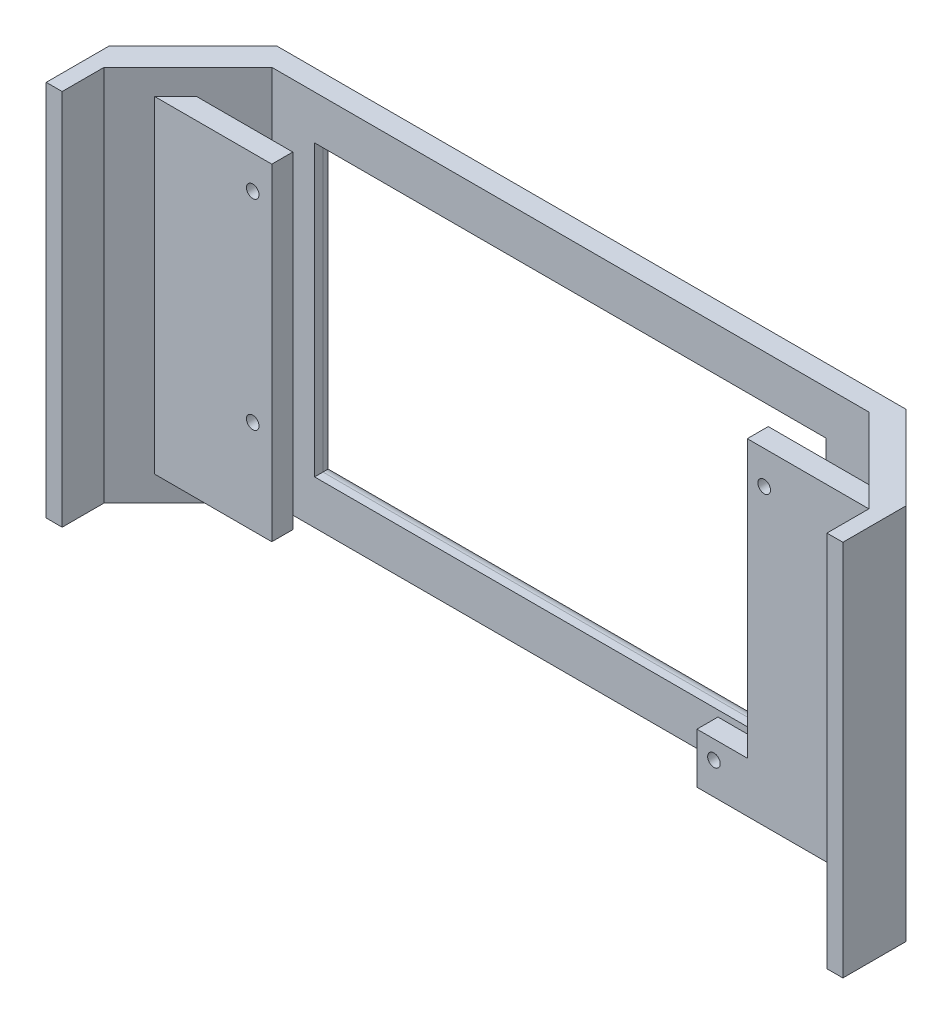
ISO-10303-21;
HEADER;
FILE_DESCRIPTION(('STEP AP214'),'2;1');
FILE_NAME('part.step','',(''),(''),'','','');
FILE_SCHEMA(('AUTOMOTIVE_DESIGN { 1 0 10303 214 1 1 1 1 }'));
ENDSEC;
DATA;
#1=APPLICATION_CONTEXT('core data for automotive mechanical design processes');
#2=APPLICATION_PROTOCOL_DEFINITION('international standard','automotive_design',2000,#1);
#3=PRODUCT_CONTEXT('',#1,'mechanical');
#4=PRODUCT('Part','Part','',(#3));
#5=PRODUCT_RELATED_PRODUCT_CATEGORY('part','',(#4));
#6=PRODUCT_DEFINITION_FORMATION('','',#4);
#7=PRODUCT_DEFINITION_CONTEXT('part definition',#1,'design');
#8=PRODUCT_DEFINITION('design','',#6,#7);
#9=PRODUCT_DEFINITION_SHAPE('','',#8);
#10=(LENGTH_UNIT() NAMED_UNIT(*) SI_UNIT(.MILLI.,.METRE.));
#11=(NAMED_UNIT(*) PLANE_ANGLE_UNIT() SI_UNIT($,.RADIAN.));
#12=(NAMED_UNIT(*) SI_UNIT($,.STERADIAN.) SOLID_ANGLE_UNIT());
#13=UNCERTAINTY_MEASURE_WITH_UNIT(LENGTH_MEASURE(1.E-05),#10,'distance_accuracy_value','');
#14=(GEOMETRIC_REPRESENTATION_CONTEXT(3) GLOBAL_UNCERTAINTY_ASSIGNED_CONTEXT((#13)) GLOBAL_UNIT_ASSIGNED_CONTEXT((#10,
#11,#12)) REPRESENTATION_CONTEXT('',''));
#15=CARTESIAN_POINT('',(0.,0.,0.));
#16=DIRECTION('',(0.,0.,1.));
#17=DIRECTION('',(1.,0.,0.));
#18=AXIS2_PLACEMENT_3D('',#15,#16,#17);
#19=CARTESIAN_POINT('',(0.,0.,5.));
#20=DIRECTION('',(0.,0.,1.));
#21=DIRECTION('',(1.,0.,0.));
#22=AXIS2_PLACEMENT_3D('',#19,#20,#21);
#23=PLANE('',#22);
#24=DIRECTION('',(1.,0.,0.));
#25=VECTOR('',#24,1.);
#26=CARTESIAN_POINT('',(-95.,-45.,5.));
#27=LINE('',#26,#25);
#28=CARTESIAN_POINT('',(-71.2000000000001,-45.,5.));
#29=VERTEX_POINT('',#28);
#30=CARTESIAN_POINT('',(71.2000000000001,-45.,5.));
#31=VERTEX_POINT('',#30);
#32=EDGE_CURVE('E388',#29,#31,#27,.T.);
#33=ORIENTED_EDGE('',*,*,#32,.T.);
#34=DIRECTION('',(0.,1.,0.));
#35=VECTOR('',#34,1.);
#36=CARTESIAN_POINT('',(71.2000000000001,0.,5.));
#37=LINE('',#36,#35);
#38=CARTESIAN_POINT('',(71.2,45.,5.));
#39=VERTEX_POINT('',#38);
#40=EDGE_CURVE('E437',#31,#39,#37,.T.);
#41=ORIENTED_EDGE('',*,*,#40,.T.);
#42=DIRECTION('',(-1.,0.,0.));
#43=VECTOR('',#42,1.);
#44=CARTESIAN_POINT('',(-95.,45.,5.));
#45=LINE('',#44,#43);
#46=CARTESIAN_POINT('',(-71.2000000000001,45.,5.));
#47=VERTEX_POINT('',#46);
#48=EDGE_CURVE('E385',#39,#47,#45,.T.);
#49=ORIENTED_EDGE('',*,*,#48,.T.);
#50=DIRECTION('',(0.,-1.,0.));
#51=VECTOR('',#50,1.);
#52=CARTESIAN_POINT('',(-71.2000000000001,0.,5.));
#53=LINE('',#52,#51);
#54=EDGE_CURVE('E435',#47,#29,#53,.T.);
#55=ORIENTED_EDGE('',*,*,#54,.T.);
#56=EDGE_LOOP('',(#33,#41,#49,#55));
#57=FACE_BOUND('',#56,.T.);
#58=DIRECTION('',(-1.,0.,0.));
#59=VECTOR('',#58,1.);
#60=CARTESIAN_POINT('',(-61.,34.5,5.));
#61=LINE('',#60,#59);
#62=CARTESIAN_POINT('',(61.,34.5,5.));
#63=VERTEX_POINT('',#62);
#64=CARTESIAN_POINT('',(-61.,34.5,5.));
#65=VERTEX_POINT('',#64);
#66=EDGE_CURVE('E366',#63,#65,#61,.T.);
#67=ORIENTED_EDGE('',*,*,#66,.F.);
#68=DIRECTION('',(0.,1.,0.));
#69=VECTOR('',#68,1.);
#70=CARTESIAN_POINT('',(61.,34.5,5.));
#71=LINE('',#70,#69);
#72=CARTESIAN_POINT('',(61.,-34.5,5.));
#73=VERTEX_POINT('',#72);
#74=EDGE_CURVE('E349',#73,#63,#71,.T.);
#75=ORIENTED_EDGE('',*,*,#74,.F.);
#76=DIRECTION('',(1.,0.,0.));
#77=VECTOR('',#76,1.);
#78=CARTESIAN_POINT('',(-61.,-34.5,5.));
#79=LINE('',#78,#77);
#80=CARTESIAN_POINT('',(-61.,-34.5,5.));
#81=VERTEX_POINT('',#80);
#82=EDGE_CURVE('E371',#81,#73,#79,.T.);
#83=ORIENTED_EDGE('',*,*,#82,.F.);
#84=DIRECTION('',(0.,-1.,0.));
#85=VECTOR('',#84,1.);
#86=CARTESIAN_POINT('',(-61.,34.5,5.));
#87=LINE('',#86,#85);
#88=EDGE_CURVE('E368',#65,#81,#87,.T.);
#89=ORIENTED_EDGE('',*,*,#88,.F.);
#90=EDGE_LOOP('',(#67,#75,#83,#89));
#91=FACE_BOUND('',#90,.T.);
#92=ADVANCED_FACE('F41',(#57,#91),#23,.T.);
#93=CARTESIAN_POINT('',(0.,0.,0.));
#94=DIRECTION('',(0.,0.,1.));
#95=DIRECTION('',(1.,0.,0.));
#96=AXIS2_PLACEMENT_3D('',#93,#94,#95);
#97=PLANE('',#96);
#98=DIRECTION('',(-1.,0.,0.));
#99=VECTOR('',#98,1.);
#100=CARTESIAN_POINT('',(-61.,37.5,0.));
#101=LINE('',#100,#99);
#102=CARTESIAN_POINT('',(64.,37.5,0.));
#103=VERTEX_POINT('',#102);
#104=CARTESIAN_POINT('',(-64.,37.5,0.));
#105=VERTEX_POINT('',#104);
#106=EDGE_CURVE('E403',#103,#105,#101,.T.);
#107=ORIENTED_EDGE('',*,*,#106,.T.);
#108=DIRECTION('',(0.,-1.,0.));
#109=VECTOR('',#108,1.);
#110=CARTESIAN_POINT('',(-64.,-34.5,0.));
#111=LINE('',#110,#109);
#112=CARTESIAN_POINT('',(-64.,-37.5,0.));
#113=VERTEX_POINT('',#112);
#114=EDGE_CURVE('E409',#105,#113,#111,.T.);
#115=ORIENTED_EDGE('',*,*,#114,.T.);
#116=DIRECTION('',(1.,0.,0.));
#117=VECTOR('',#116,1.);
#118=CARTESIAN_POINT('',(61.,-37.5,0.));
#119=LINE('',#118,#117);
#120=CARTESIAN_POINT('',(64.,-37.5,0.));
#121=VERTEX_POINT('',#120);
#122=EDGE_CURVE('E407',#113,#121,#119,.T.);
#123=ORIENTED_EDGE('',*,*,#122,.T.);
#124=DIRECTION('',(0.,1.,0.));
#125=VECTOR('',#124,1.);
#126=CARTESIAN_POINT('',(64.,34.5,0.));
#127=LINE('',#126,#125);
#128=EDGE_CURVE('E405',#121,#103,#127,.T.);
#129=ORIENTED_EDGE('',*,*,#128,.T.);
#130=EDGE_LOOP('',(#107,#115,#123,#129));
#131=FACE_BOUND('',#130,.T.);
#132=DIRECTION('',(-1.,0.,0.));
#133=VECTOR('',#132,1.);
#134=CARTESIAN_POINT('',(-95.,45.,0.));
#135=LINE('',#134,#133);
#136=CARTESIAN_POINT('',(74.9999999999998,45.,0.));
#137=VERTEX_POINT('',#136);
#138=CARTESIAN_POINT('',(-74.9999999999999,45.,0.));
#139=VERTEX_POINT('',#138);
#140=EDGE_CURVE('E240',#137,#139,#135,.T.);
#141=ORIENTED_EDGE('',*,*,#140,.F.);
#142=DIRECTION('',(0.,-1.,0.));
#143=VECTOR('',#142,1.);
#144=CARTESIAN_POINT('',(74.9999999999999,0.,0.));
#145=LINE('',#144,#143);
#146=CARTESIAN_POINT('',(74.9999999999999,-45.,0.));
#147=VERTEX_POINT('',#146);
#148=EDGE_CURVE('E260',#137,#147,#145,.T.);
#149=ORIENTED_EDGE('',*,*,#148,.T.);
#150=DIRECTION('',(1.,0.,0.));
#151=VECTOR('',#150,1.);
#152=CARTESIAN_POINT('',(-95.,-45.,0.));
#153=LINE('',#152,#151);
#154=CARTESIAN_POINT('',(-74.9999999999999,-45.,0.));
#155=VERTEX_POINT('',#154);
#156=EDGE_CURVE('E389',#155,#147,#153,.T.);
#157=ORIENTED_EDGE('',*,*,#156,.F.);
#158=DIRECTION('',(0.,1.,0.));
#159=VECTOR('',#158,1.);
#160=CARTESIAN_POINT('',(-74.9999999999999,0.,0.));
#161=LINE('',#160,#159);
#162=EDGE_CURVE('E264',#155,#139,#161,.T.);
#163=ORIENTED_EDGE('',*,*,#162,.T.);
#164=EDGE_LOOP('',(#141,#149,#157,#163));
#165=FACE_BOUND('',#164,.T.);
#166=ADVANCED_FACE('F443',(#131,#165),#97,.F.);
#167=CARTESIAN_POINT('',(95.,45.,5.));
#168=DIRECTION('',(-1.,0.,0.));
#169=DIRECTION('',(0.,-1.,0.));
#170=AXIS2_PLACEMENT_3D('',#167,#168,#169);
#171=PLANE('',#170);
#172=DIRECTION('',(0.,0.,-1.));
#173=VECTOR('',#172,1.);
#174=CARTESIAN_POINT('',(95.,-45.,5.));
#175=LINE('',#174,#173);
#176=CARTESIAN_POINT('',(95.,-45.,35.));
#177=VERTEX_POINT('',#176);
#178=CARTESIAN_POINT('',(95.,-45.,20.));
#179=VERTEX_POINT('',#178);
#180=EDGE_CURVE('E392',#177,#179,#175,.T.);
#181=ORIENTED_EDGE('',*,*,#180,.T.);
#182=DIRECTION('',(0.,1.,0.));
#183=VECTOR('',#182,1.);
#184=CARTESIAN_POINT('',(95.,45.,20.));
#185=LINE('',#184,#183);
#186=CARTESIAN_POINT('',(95.,45.,20.));
#187=VERTEX_POINT('',#186);
#188=EDGE_CURVE('E439',#179,#187,#185,.T.);
#189=ORIENTED_EDGE('',*,*,#188,.T.);
#190=DIRECTION('',(0.,0.,-1.));
#191=VECTOR('',#190,1.);
#192=CARTESIAN_POINT('',(95.,45.,5.));
#193=LINE('',#192,#191);
#194=CARTESIAN_POINT('',(95.,45.,35.));
#195=VERTEX_POINT('',#194);
#196=EDGE_CURVE('E255',#195,#187,#193,.T.);
#197=ORIENTED_EDGE('',*,*,#196,.F.);
#198=DIRECTION('',(0.,1.,0.));
#199=VECTOR('',#198,1.);
#200=CARTESIAN_POINT('',(95.,45.,35.));
#201=LINE('',#200,#199);
#202=EDGE_CURVE('E337',#177,#195,#201,.T.);
#203=ORIENTED_EDGE('',*,*,#202,.F.);
#204=EDGE_LOOP('',(#181,#189,#197,#203));
#205=FACE_BOUND('',#204,.T.);
#206=ADVANCED_FACE('F452',(#205),#171,.F.);
#207=CARTESIAN_POINT('',(-95.,45.,5.));
#208=DIRECTION('',(0.,-1.,0.));
#209=DIRECTION('',(0.,0.,-1.));
#210=AXIS2_PLACEMENT_3D('',#207,#208,#209);
#211=PLANE('',#210);
#212=ORIENTED_EDGE('',*,*,#196,.T.);
#213=DIRECTION('',(0.707106781186549,0.,0.707106781186546));
#214=VECTOR('',#213,1.);
#215=CARTESIAN_POINT('',(95.,45.,20.));
#216=LINE('',#215,#214);
#217=EDGE_CURVE('E244',#187,#137,#216,.F.);
#218=ORIENTED_EDGE('',*,*,#217,.T.);
#219=ORIENTED_EDGE('',*,*,#140,.T.);
#220=DIRECTION('',(0.707106781186549,0.,-0.707106781186547));
#221=VECTOR('',#220,1.);
#222=CARTESIAN_POINT('',(-95.,45.,20.));
#223=LINE('',#222,#221);
#224=CARTESIAN_POINT('',(-95.,45.,20.));
#225=VERTEX_POINT('',#224);
#226=EDGE_CURVE('E232',#139,#225,#223,.F.);
#227=ORIENTED_EDGE('',*,*,#226,.T.);
#228=DIRECTION('',(0.,0.,-1.));
#229=VECTOR('',#228,1.);
#230=CARTESIAN_POINT('',(-95.,45.,5.));
#231=LINE('',#230,#229);
#232=CARTESIAN_POINT('',(-95.,45.,35.));
#233=VERTEX_POINT('',#232);
#234=EDGE_CURVE('E237',#233,#225,#231,.T.);
#235=ORIENTED_EDGE('',*,*,#234,.F.);
#236=DIRECTION('',(-1.,0.,0.));
#237=VECTOR('',#236,1.);
#238=CARTESIAN_POINT('',(-95.,45.,35.));
#239=LINE('',#238,#237);
#240=CARTESIAN_POINT('',(-91.2,45.,35.));
#241=VERTEX_POINT('',#240);
#242=EDGE_CURVE('E341',#241,#233,#239,.T.);
#243=ORIENTED_EDGE('',*,*,#242,.F.);
#244=DIRECTION('',(0.,0.,-1.));
#245=VECTOR('',#244,1.);
#246=CARTESIAN_POINT('',(-91.2,45.,35.));
#247=LINE('',#246,#245);
#248=CARTESIAN_POINT('',(-91.2,45.,25.0000000000001));
#249=VERTEX_POINT('',#248);
#250=EDGE_CURVE('E343',#241,#249,#247,.T.);
#251=ORIENTED_EDGE('',*,*,#250,.T.);
#252=DIRECTION('',(0.707106781186543,0.,-0.707106781186552));
#253=VECTOR('',#252,1.);
#254=CARTESIAN_POINT('',(-83.0999999999999,45.,16.8999999999999));
#255=LINE('',#254,#253);
#256=EDGE_CURVE('E61',#249,#47,#255,.T.);
#257=ORIENTED_EDGE('',*,*,#256,.T.);
#258=ORIENTED_EDGE('',*,*,#48,.F.);
#259=DIRECTION('',(0.707106781186543,0.,0.707106781186552));
#260=VECTOR('',#259,1.);
#261=CARTESIAN_POINT('',(-11.8999999999989,45.,-78.1));
#262=LINE('',#261,#260);
#263=CARTESIAN_POINT('',(91.2,45.,25.0000000000001));
#264=VERTEX_POINT('',#263);
#265=EDGE_CURVE('E269',#39,#264,#262,.T.);
#266=ORIENTED_EDGE('',*,*,#265,.T.);
#267=DIRECTION('',(0.,0.,-1.));
#268=VECTOR('',#267,1.);
#269=CARTESIAN_POINT('',(91.2,45.,35.));
#270=LINE('',#269,#268);
#271=CARTESIAN_POINT('',(91.2,45.,35.));
#272=VERTEX_POINT('',#271);
#273=EDGE_CURVE('E350',#272,#264,#270,.T.);
#274=ORIENTED_EDGE('',*,*,#273,.F.);
#275=DIRECTION('',(-1.,0.,0.));
#276=VECTOR('',#275,1.);
#277=CARTESIAN_POINT('',(95.,45.,35.));
#278=LINE('',#277,#276);
#279=EDGE_CURVE('E361',#195,#272,#278,.T.);
#280=ORIENTED_EDGE('',*,*,#279,.F.);
#281=EDGE_LOOP('',(#212,#218,#219,#227,#235,#243,#251,#257,#258,#266,#274,#280));
#282=FACE_BOUND('',#281,.T.);
#283=ADVANCED_FACE('F235',(#282),#211,.F.);
#284=CARTESIAN_POINT('',(-95.,45.,5.));
#285=DIRECTION('',(1.,0.,0.));
#286=DIRECTION('',(0.,0.,-1.));
#287=AXIS2_PLACEMENT_3D('',#284,#285,#286);
#288=PLANE('',#287);
#289=ORIENTED_EDGE('',*,*,#234,.T.);
#290=DIRECTION('',(0.,-1.,0.));
#291=VECTOR('',#290,1.);
#292=CARTESIAN_POINT('',(-95.,45.,20.));
#293=LINE('',#292,#291);
#294=CARTESIAN_POINT('',(-95.,-45.,20.));
#295=VERTEX_POINT('',#294);
#296=EDGE_CURVE('E251',#225,#295,#293,.T.);
#297=ORIENTED_EDGE('',*,*,#296,.T.);
#298=DIRECTION('',(0.,0.,-1.));
#299=VECTOR('',#298,1.);
#300=CARTESIAN_POINT('',(-95.,-45.,5.));
#301=LINE('',#300,#299);
#302=CARTESIAN_POINT('',(-95.,-45.,35.));
#303=VERTEX_POINT('',#302);
#304=EDGE_CURVE('E256',#303,#295,#301,.T.);
#305=ORIENTED_EDGE('',*,*,#304,.F.);
#306=DIRECTION('',(0.,-1.,0.));
#307=VECTOR('',#306,1.);
#308=CARTESIAN_POINT('',(-95.,45.,35.));
#309=LINE('',#308,#307);
#310=EDGE_CURVE('E254',#233,#303,#309,.T.);
#311=ORIENTED_EDGE('',*,*,#310,.F.);
#312=EDGE_LOOP('',(#289,#297,#305,#311));
#313=FACE_BOUND('',#312,.T.);
#314=ADVANCED_FACE('F250',(#313),#288,.F.);
#315=CARTESIAN_POINT('',(-95.,-45.,5.));
#316=DIRECTION('',(0.,1.,0.));
#317=DIRECTION('',(0.,0.,1.));
#318=AXIS2_PLACEMENT_3D('',#315,#316,#317);
#319=PLANE('',#318);
#320=ORIENTED_EDGE('',*,*,#156,.T.);
#321=DIRECTION('',(-0.707106781186549,0.,-0.707106781186546));
#322=VECTOR('',#321,1.);
#323=CARTESIAN_POINT('',(95.,-45.,20.));
#324=LINE('',#323,#322);
#325=EDGE_CURVE('E11',#147,#179,#324,.F.);
#326=ORIENTED_EDGE('',*,*,#325,.T.);
#327=ORIENTED_EDGE('',*,*,#180,.F.);
#328=DIRECTION('',(1.,0.,0.));
#329=VECTOR('',#328,1.);
#330=CARTESIAN_POINT('',(95.,-45.,35.));
#331=LINE('',#330,#329);
#332=CARTESIAN_POINT('',(91.2,-45.,35.));
#333=VERTEX_POINT('',#332);
#334=EDGE_CURVE('E356',#333,#177,#331,.T.);
#335=ORIENTED_EDGE('',*,*,#334,.F.);
#336=DIRECTION('',(0.,0.,-1.));
#337=VECTOR('',#336,1.);
#338=CARTESIAN_POINT('',(91.2,-45.,35.));
#339=LINE('',#338,#337);
#340=CARTESIAN_POINT('',(91.2,-45.,25.0000000000001));
#341=VERTEX_POINT('',#340);
#342=EDGE_CURVE('E353',#333,#341,#339,.T.);
#343=ORIENTED_EDGE('',*,*,#342,.T.);
#344=DIRECTION('',(-0.707106781186543,0.,-0.707106781186552));
#345=VECTOR('',#344,1.);
#346=CARTESIAN_POINT('',(-11.8999999999989,-45.,-78.1));
#347=LINE('',#346,#345);
#348=EDGE_CURVE('E262',#341,#31,#347,.T.);
#349=ORIENTED_EDGE('',*,*,#348,.T.);
#350=ORIENTED_EDGE('',*,*,#32,.F.);
#351=DIRECTION('',(-0.707106781186543,0.,0.707106781186552));
#352=VECTOR('',#351,1.);
#353=CARTESIAN_POINT('',(-83.0999999999999,-45.,16.8999999999999));
#354=LINE('',#353,#352);
#355=CARTESIAN_POINT('',(-91.2,-45.,25.0000000000001));
#356=VERTEX_POINT('',#355);
#357=EDGE_CURVE('E245',#29,#356,#354,.T.);
#358=ORIENTED_EDGE('',*,*,#357,.T.);
#359=DIRECTION('',(0.,0.,-1.));
#360=VECTOR('',#359,1.);
#361=CARTESIAN_POINT('',(-91.2,-45.,35.));
#362=LINE('',#361,#360);
#363=CARTESIAN_POINT('',(-91.2,-45.,35.));
#364=VERTEX_POINT('',#363);
#365=EDGE_CURVE('E346',#364,#356,#362,.T.);
#366=ORIENTED_EDGE('',*,*,#365,.F.);
#367=DIRECTION('',(1.,0.,0.));
#368=VECTOR('',#367,1.);
#369=CARTESIAN_POINT('',(-95.,-45.,35.));
#370=LINE('',#369,#368);
#371=EDGE_CURVE('E336',#303,#364,#370,.T.);
#372=ORIENTED_EDGE('',*,*,#371,.F.);
#373=ORIENTED_EDGE('',*,*,#304,.T.);
#374=DIRECTION('',(-0.707106781186549,0.,0.707106781186547));
#375=VECTOR('',#374,1.);
#376=CARTESIAN_POINT('',(-95.,-45.,20.));
#377=LINE('',#376,#375);
#378=EDGE_CURVE('E52',#295,#155,#377,.F.);
#379=ORIENTED_EDGE('',*,*,#378,.T.);
#380=EDGE_LOOP('',(#320,#326,#327,#335,#343,#349,#350,#358,#366,#372,#373,#379));
#381=FACE_BOUND('',#380,.T.);
#382=ADVANCED_FACE('F447',(#381),#319,.F.);
#383=CARTESIAN_POINT('',(61.,34.5,5.));
#384=DIRECTION('',(-1.,0.,0.));
#385=DIRECTION('',(0.,-1.,0.));
#386=AXIS2_PLACEMENT_3D('',#383,#384,#385);
#387=PLANE('',#386);
#388=DIRECTION('',(0.,0.,-1.));
#389=VECTOR('',#388,1.);
#390=CARTESIAN_POINT('',(61.,34.5,5.));
#391=LINE('',#390,#389);
#392=CARTESIAN_POINT('',(61.,34.5,3.));
#393=VERTEX_POINT('',#392);
#394=EDGE_CURVE('E382',#63,#393,#391,.T.);
#395=ORIENTED_EDGE('',*,*,#394,.T.);
#396=DIRECTION('',(0.,1.,0.));
#397=VECTOR('',#396,1.);
#398=CARTESIAN_POINT('',(61.,-34.5,3.));
#399=LINE('',#398,#397);
#400=CARTESIAN_POINT('',(61.,-34.5,3.));
#401=VERTEX_POINT('',#400);
#402=EDGE_CURVE('E417',#393,#401,#399,.F.);
#403=ORIENTED_EDGE('',*,*,#402,.T.);
#404=DIRECTION('',(0.,0.,-1.));
#405=VECTOR('',#404,1.);
#406=CARTESIAN_POINT('',(61.,-34.5,5.));
#407=LINE('',#406,#405);
#408=EDGE_CURVE('E373',#73,#401,#407,.T.);
#409=ORIENTED_EDGE('',*,*,#408,.F.);
#410=ORIENTED_EDGE('',*,*,#74,.T.);
#411=EDGE_LOOP('',(#395,#403,#409,#410));
#412=FACE_BOUND('',#411,.T.);
#413=ADVANCED_FACE('F505',(#412),#387,.T.);
#414=CARTESIAN_POINT('',(-61.,34.5,5.));
#415=DIRECTION('',(0.,-1.,0.));
#416=DIRECTION('',(0.,0.,-1.));
#417=AXIS2_PLACEMENT_3D('',#414,#415,#416);
#418=PLANE('',#417);
#419=DIRECTION('',(0.,0.,-1.));
#420=VECTOR('',#419,1.);
#421=CARTESIAN_POINT('',(-61.,34.5,5.));
#422=LINE('',#421,#420);
#423=CARTESIAN_POINT('',(-61.,34.5,3.));
#424=VERTEX_POINT('',#423);
#425=EDGE_CURVE('E379',#65,#424,#422,.T.);
#426=ORIENTED_EDGE('',*,*,#425,.T.);
#427=DIRECTION('',(-1.,0.,0.));
#428=VECTOR('',#427,1.);
#429=CARTESIAN_POINT('',(61.,34.5,3.));
#430=LINE('',#429,#428);
#431=EDGE_CURVE('E419',#424,#393,#430,.F.);
#432=ORIENTED_EDGE('',*,*,#431,.T.);
#433=ORIENTED_EDGE('',*,*,#394,.F.);
#434=ORIENTED_EDGE('',*,*,#66,.T.);
#435=EDGE_LOOP('',(#426,#432,#433,#434));
#436=FACE_BOUND('',#435,.T.);
#437=ADVANCED_FACE('F812',(#436),#418,.T.);
#438=CARTESIAN_POINT('',(-61.,34.5,5.));
#439=DIRECTION('',(1.,0.,0.));
#440=DIRECTION('',(0.,1.,0.));
#441=AXIS2_PLACEMENT_3D('',#438,#439,#440);
#442=PLANE('',#441);
#443=DIRECTION('',(0.,0.,-1.));
#444=VECTOR('',#443,1.);
#445=CARTESIAN_POINT('',(-61.,-34.5,5.));
#446=LINE('',#445,#444);
#447=CARTESIAN_POINT('',(-61.,-34.5,3.));
#448=VERTEX_POINT('',#447);
#449=EDGE_CURVE('E376',#81,#448,#446,.T.);
#450=ORIENTED_EDGE('',*,*,#449,.T.);
#451=DIRECTION('',(0.,-1.,0.));
#452=VECTOR('',#451,1.);
#453=CARTESIAN_POINT('',(-61.,34.5,3.));
#454=LINE('',#453,#452);
#455=EDGE_CURVE('E412',#448,#424,#454,.F.);
#456=ORIENTED_EDGE('',*,*,#455,.T.);
#457=ORIENTED_EDGE('',*,*,#425,.F.);
#458=ORIENTED_EDGE('',*,*,#88,.T.);
#459=EDGE_LOOP('',(#450,#456,#457,#458));
#460=FACE_BOUND('',#459,.T.);
#461=ADVANCED_FACE('F821',(#460),#442,.T.);
#462=CARTESIAN_POINT('',(-61.,-34.5,5.));
#463=DIRECTION('',(0.,1.,0.));
#464=DIRECTION('',(0.,0.,1.));
#465=AXIS2_PLACEMENT_3D('',#462,#463,#464);
#466=PLANE('',#465);
#467=ORIENTED_EDGE('',*,*,#408,.T.);
#468=DIRECTION('',(1.,0.,0.));
#469=VECTOR('',#468,1.);
#470=CARTESIAN_POINT('',(-61.,-34.5,3.));
#471=LINE('',#470,#469);
#472=EDGE_CURVE('E415',#401,#448,#471,.F.);
#473=ORIENTED_EDGE('',*,*,#472,.T.);
#474=ORIENTED_EDGE('',*,*,#449,.F.);
#475=ORIENTED_EDGE('',*,*,#82,.T.);
#476=EDGE_LOOP('',(#467,#473,#474,#475));
#477=FACE_BOUND('',#476,.T.);
#478=ADVANCED_FACE('F746',(#477),#466,.T.);
#479=CARTESIAN_POINT('',(91.2,45.,35.));
#480=DIRECTION('',(1.,0.,0.));
#481=DIRECTION('',(0.,1.,0.));
#482=AXIS2_PLACEMENT_3D('',#479,#480,#481);
#483=PLANE('',#482);
#484=ORIENTED_EDGE('',*,*,#273,.T.);
#485=DIRECTION('',(0.,-1.,0.));
#486=VECTOR('',#485,1.);
#487=CARTESIAN_POINT('',(91.2,45.,25.0000000000001));
#488=LINE('',#487,#486);
#489=EDGE_CURVE('E421',#264,#341,#488,.T.);
#490=ORIENTED_EDGE('',*,*,#489,.T.);
#491=ORIENTED_EDGE('',*,*,#342,.F.);
#492=DIRECTION('',(0.,-1.,0.));
#493=VECTOR('',#492,1.);
#494=CARTESIAN_POINT('',(91.2,45.,35.));
#495=LINE('',#494,#493);
#496=EDGE_CURVE('E359',#272,#333,#495,.T.);
#497=ORIENTED_EDGE('',*,*,#496,.F.);
#498=EDGE_LOOP('',(#484,#490,#491,#497));
#499=FACE_BOUND('',#498,.T.);
#500=ADVANCED_FACE('F463',(#499),#483,.F.);
#501=CARTESIAN_POINT('',(0.,0.,35.));
#502=DIRECTION('',(0.,0.,-1.));
#503=DIRECTION('',(-1.,0.,0.));
#504=AXIS2_PLACEMENT_3D('',#501,#502,#503);
#505=PLANE('',#504);
#506=ORIENTED_EDGE('',*,*,#202,.T.);
#507=ORIENTED_EDGE('',*,*,#279,.T.);
#508=ORIENTED_EDGE('',*,*,#496,.T.);
#509=ORIENTED_EDGE('',*,*,#334,.T.);
#510=EDGE_LOOP('',(#506,#507,#508,#509));
#511=FACE_BOUND('',#510,.T.);
#512=ADVANCED_FACE('F458',(#511),#505,.F.);
#513=CARTESIAN_POINT('',(-91.2,45.,35.));
#514=DIRECTION('',(-1.,0.,0.));
#515=DIRECTION('',(0.,-1.,0.));
#516=AXIS2_PLACEMENT_3D('',#513,#514,#515);
#517=PLANE('',#516);
#518=ORIENTED_EDGE('',*,*,#365,.T.);
#519=DIRECTION('',(0.,1.,0.));
#520=VECTOR('',#519,1.);
#521=CARTESIAN_POINT('',(-91.2,45.,25.0000000000001));
#522=LINE('',#521,#520);
#523=EDGE_CURVE('E259',#356,#249,#522,.T.);
#524=ORIENTED_EDGE('',*,*,#523,.T.);
#525=ORIENTED_EDGE('',*,*,#250,.F.);
#526=DIRECTION('',(0.,1.,0.));
#527=VECTOR('',#526,1.);
#528=CARTESIAN_POINT('',(-91.2,45.,35.));
#529=LINE('',#528,#527);
#530=EDGE_CURVE('E339',#364,#241,#529,.T.);
#531=ORIENTED_EDGE('',*,*,#530,.F.);
#532=EDGE_LOOP('',(#518,#524,#525,#531));
#533=FACE_BOUND('',#532,.T.);
#534=ADVANCED_FACE('F476',(#533),#517,.F.);
#535=CARTESIAN_POINT('',(0.,0.,35.));
#536=DIRECTION('',(0.,0.,1.));
#537=DIRECTION('',(1.,0.,0.));
#538=AXIS2_PLACEMENT_3D('',#535,#536,#537);
#539=PLANE('',#538);
#540=ORIENTED_EDGE('',*,*,#310,.T.);
#541=ORIENTED_EDGE('',*,*,#371,.T.);
#542=ORIENTED_EDGE('',*,*,#530,.T.);
#543=ORIENTED_EDGE('',*,*,#242,.T.);
#544=EDGE_LOOP('',(#540,#541,#542,#543));
#545=FACE_BOUND('',#544,.T.);
#546=ADVANCED_FACE('F481',(#545),#539,.T.);
#547=CARTESIAN_POINT('',(-91.2,-92.2652091923859,14.));
#548=DIRECTION('',(0.,0.,-1.));
#549=DIRECTION('',(-1.,0.,0.));
#550=AXIS2_PLACEMENT_3D('',#547,#548,#549);
#551=PLANE('',#550);
#552=CARTESIAN_POINT('',(-61.75,-16.61,14.));
#553=DIRECTION('',(0.,0.,-1.));
#554=DIRECTION('',(-1.,0.,0.));
#555=AXIS2_PLACEMENT_3D('',#552,#553,#554);
#556=CIRCLE('',#555,1.5);
#557=CARTESIAN_POINT('',(-63.25,-16.61,14.));
#558=VERTEX_POINT('',#557);
#559=EDGE_CURVE('E928',#558,#558,#556,.F.);
#560=ORIENTED_EDGE('',*,*,#559,.T.);
#561=EDGE_LOOP('',(#560));
#562=FACE_BOUND('',#561,.T.);
#563=CARTESIAN_POINT('',(-61.75,31.13,14.));
#564=DIRECTION('',(0.,0.,-1.));
#565=DIRECTION('',(-1.,0.,0.));
#566=AXIS2_PLACEMENT_3D('',#563,#564,#565);
#567=CIRCLE('',#566,1.5);
#568=CARTESIAN_POINT('',(-63.25,31.13,14.));
#569=VERTEX_POINT('',#568);
#570=EDGE_CURVE('E297',#569,#569,#567,.F.);
#571=ORIENTED_EDGE('',*,*,#570,.T.);
#572=EDGE_LOOP('',(#571));
#573=FACE_BOUND('',#572,.T.);
#574=DIRECTION('',(1.,0.,0.));
#575=VECTOR('',#574,1.);
#576=CARTESIAN_POINT('',(-91.2,39.,14.));
#577=LINE('',#576,#575);
#578=CARTESIAN_POINT('',(-80.2,39.,14.));
#579=VERTEX_POINT('',#578);
#580=CARTESIAN_POINT('',(-57.2,39.,14.));
#581=VERTEX_POINT('',#580);
#582=EDGE_CURVE('E294',#579,#581,#577,.T.);
#583=ORIENTED_EDGE('',*,*,#582,.T.);
#584=DIRECTION('',(0.,1.,0.));
#585=VECTOR('',#584,1.);
#586=CARTESIAN_POINT('',(-57.2,-92.2652091923859,14.));
#587=LINE('',#586,#585);
#588=CARTESIAN_POINT('',(-57.2,-39.,14.));
#589=VERTEX_POINT('',#588);
#590=EDGE_CURVE('E326',#589,#581,#587,.T.);
#591=ORIENTED_EDGE('',*,*,#590,.F.);
#592=DIRECTION('',(-1.,0.,0.));
#593=VECTOR('',#592,1.);
#594=CARTESIAN_POINT('',(-91.2,-39.,14.));
#595=LINE('',#594,#593);
#596=CARTESIAN_POINT('',(-80.1999999999999,-39.,14.));
#597=VERTEX_POINT('',#596);
#598=EDGE_CURVE('E287',#589,#597,#595,.T.);
#599=ORIENTED_EDGE('',*,*,#598,.T.);
#600=DIRECTION('',(0.,1.,0.));
#601=VECTOR('',#600,1.);
#602=CARTESIAN_POINT('',(-80.1999999999999,-92.2652091923859,14.));
#603=LINE('',#602,#601);
#604=EDGE_CURVE('E46',#597,#579,#603,.T.);
#605=ORIENTED_EDGE('',*,*,#604,.T.);
#606=EDGE_LOOP('',(#583,#591,#599,#605));
#607=FACE_BOUND('',#606,.T.);
#608=ADVANCED_FACE('F483',(#562,#573,#607),#551,.T.);
#609=CARTESIAN_POINT('',(-57.2,-92.2652091923859,14.));
#610=DIRECTION('',(1.,0.,0.));
#611=DIRECTION('',(0.,0.,-1.));
#612=AXIS2_PLACEMENT_3D('',#609,#610,#611);
#613=PLANE('',#612);
#614=DIRECTION('',(0.,0.,-1.));
#615=VECTOR('',#614,1.);
#616=CARTESIAN_POINT('',(-57.2,39.,14.));
#617=LINE('',#616,#615);
#618=CARTESIAN_POINT('',(-57.2,39.,19.));
#619=VERTEX_POINT('',#618);
#620=EDGE_CURVE('E292',#619,#581,#617,.T.);
#621=ORIENTED_EDGE('',*,*,#620,.F.);
#622=DIRECTION('',(0.,1.,0.));
#623=VECTOR('',#622,1.);
#624=CARTESIAN_POINT('',(-57.2,-92.2652091923859,19.));
#625=LINE('',#624,#623);
#626=CARTESIAN_POINT('',(-57.2,-39.,19.));
#627=VERTEX_POINT('',#626);
#628=EDGE_CURVE('E296',#627,#619,#625,.T.);
#629=ORIENTED_EDGE('',*,*,#628,.F.);
#630=DIRECTION('',(0.,0.,1.));
#631=VECTOR('',#630,1.);
#632=CARTESIAN_POINT('',(-57.2,-39.,14.));
#633=LINE('',#632,#631);
#634=EDGE_CURVE('E323',#589,#627,#633,.T.);
#635=ORIENTED_EDGE('',*,*,#634,.F.);
#636=ORIENTED_EDGE('',*,*,#590,.T.);
#637=EDGE_LOOP('',(#621,#629,#635,#636));
#638=FACE_BOUND('',#637,.T.);
#639=ADVANCED_FACE('F490',(#638),#613,.T.);
#640=CARTESIAN_POINT('',(-91.2,-92.2652091923859,19.));
#641=DIRECTION('',(0.,0.,1.));
#642=DIRECTION('',(1.,0.,0.));
#643=AXIS2_PLACEMENT_3D('',#640,#641,#642);
#644=PLANE('',#643);
#645=CARTESIAN_POINT('',(-61.75,-16.61,19.));
#646=DIRECTION('',(0.,0.,1.));
#647=DIRECTION('',(1.,0.,0.));
#648=AXIS2_PLACEMENT_3D('',#645,#646,#647);
#649=CIRCLE('',#648,1.5);
#650=CARTESIAN_POINT('',(-60.25,-16.61,19.));
#651=VERTEX_POINT('',#650);
#652=EDGE_CURVE('E307',#651,#651,#649,.T.);
#653=ORIENTED_EDGE('',*,*,#652,.F.);
#654=EDGE_LOOP('',(#653));
#655=FACE_BOUND('',#654,.T.);
#656=CARTESIAN_POINT('',(-61.75,31.13,19.));
#657=DIRECTION('',(0.,0.,1.));
#658=DIRECTION('',(1.,0.,0.));
#659=AXIS2_PLACEMENT_3D('',#656,#657,#658);
#660=CIRCLE('',#659,1.5);
#661=CARTESIAN_POINT('',(-60.25,31.13,19.));
#662=VERTEX_POINT('',#661);
#663=EDGE_CURVE('E302',#662,#662,#660,.T.);
#664=ORIENTED_EDGE('',*,*,#663,.F.);
#665=EDGE_LOOP('',(#664));
#666=FACE_BOUND('',#665,.T.);
#667=DIRECTION('',(1.,0.,0.));
#668=VECTOR('',#667,1.);
#669=CARTESIAN_POINT('',(-91.2,39.,19.));
#670=LINE('',#669,#668);
#671=CARTESIAN_POINT('',(-85.1999999999999,39.,19.));
#672=VERTEX_POINT('',#671);
#673=EDGE_CURVE('E313',#672,#619,#670,.T.);
#674=ORIENTED_EDGE('',*,*,#673,.F.);
#675=DIRECTION('',(0.,1.,0.));
#676=VECTOR('',#675,1.);
#677=CARTESIAN_POINT('',(-85.1999999999999,45.,19.));
#678=LINE('',#677,#676);
#679=CARTESIAN_POINT('',(-85.1999999999999,-39.,19.));
#680=VERTEX_POINT('',#679);
#681=EDGE_CURVE('E283',#680,#672,#678,.T.);
#682=ORIENTED_EDGE('',*,*,#681,.F.);
#683=DIRECTION('',(-1.,0.,0.));
#684=VECTOR('',#683,1.);
#685=CARTESIAN_POINT('',(-91.2,-39.,19.));
#686=LINE('',#685,#684);
#687=EDGE_CURVE('E318',#627,#680,#686,.T.);
#688=ORIENTED_EDGE('',*,*,#687,.F.);
#689=ORIENTED_EDGE('',*,*,#628,.T.);
#690=EDGE_LOOP('',(#674,#682,#688,#689));
#691=FACE_BOUND('',#690,.T.);
#692=ADVANCED_FACE('F714',(#655,#666,#691),#644,.T.);
#693=CARTESIAN_POINT('',(91.2,-92.2652091923859,19.));
#694=DIRECTION('',(0.,0.,1.));
#695=DIRECTION('',(1.,0.,0.));
#696=AXIS2_PLACEMENT_3D('',#693,#694,#695);
#697=PLANE('',#696);
#698=DIRECTION('',(1.,0.,0.));
#699=VECTOR('',#698,1.);
#700=CARTESIAN_POINT('',(44.2,-27.,19.));
#701=LINE('',#700,#699);
#702=CARTESIAN_POINT('',(44.2,-27.,19.));
#703=VERTEX_POINT('',#702);
#704=CARTESIAN_POINT('',(56.2,-27.,19.));
#705=VERTEX_POINT('',#704);
#706=EDGE_CURVE('E432',#703,#705,#701,.T.);
#707=ORIENTED_EDGE('',*,*,#706,.F.);
#708=DIRECTION('',(0.,1.,0.));
#709=VECTOR('',#708,1.);
#710=CARTESIAN_POINT('',(44.2,-92.2652091923859,19.));
#711=LINE('',#710,#709);
#712=CARTESIAN_POINT('',(44.2,-39.,19.));
#713=VERTEX_POINT('',#712);
#714=EDGE_CURVE('E291',#713,#703,#711,.T.);
#715=ORIENTED_EDGE('',*,*,#714,.F.);
#716=CARTESIAN_POINT('',(85.1999999999999,-39.,19.));
#717=VERTEX_POINT('',#716);
#718=EDGE_CURVE('E316',#717,#713,#686,.T.);
#719=ORIENTED_EDGE('',*,*,#718,.F.);
#720=DIRECTION('',(0.,1.,0.));
#721=VECTOR('',#720,1.);
#722=CARTESIAN_POINT('',(85.1999999999999,-92.2652091923859,19.));
#723=LINE('',#722,#721);
#724=CARTESIAN_POINT('',(85.1999999999999,39.,19.));
#725=VERTEX_POINT('',#724);
#726=EDGE_CURVE('E288',#717,#725,#723,.T.);
#727=ORIENTED_EDGE('',*,*,#726,.T.);
#728=CARTESIAN_POINT('',(56.2,39.,19.));
#729=VERTEX_POINT('',#728);
#730=EDGE_CURVE('E315',#729,#725,#670,.T.);
#731=ORIENTED_EDGE('',*,*,#730,.F.);
#732=DIRECTION('',(0.,1.,0.));
#733=VECTOR('',#732,1.);
#734=CARTESIAN_POINT('',(56.2,39.,19.));
#735=LINE('',#734,#733);
#736=EDGE_CURVE('E916',#705,#729,#735,.T.);
#737=ORIENTED_EDGE('',*,*,#736,.F.);
#738=EDGE_LOOP('',(#707,#715,#719,#727,#731,#737));
#739=FACE_BOUND('',#738,.T.);
#740=CARTESIAN_POINT('',(48.25,-31.3800000000001,19.));
#741=DIRECTION('',(0.,0.,1.));
#742=DIRECTION('',(1.,0.,0.));
#743=AXIS2_PLACEMENT_3D('',#740,#741,#742);
#744=CIRCLE('',#743,1.5);
#745=CARTESIAN_POINT('',(49.75,-31.3800000000001,19.));
#746=VERTEX_POINT('',#745);
#747=EDGE_CURVE('E937',#746,#746,#744,.T.);
#748=ORIENTED_EDGE('',*,*,#747,.F.);
#749=EDGE_LOOP('',(#748));
#750=FACE_BOUND('',#749,.T.);
#751=CARTESIAN_POINT('',(60.23,31.13,19.));
#752=DIRECTION('',(0.,0.,1.));
#753=DIRECTION('',(1.,0.,0.));
#754=AXIS2_PLACEMENT_3D('',#751,#752,#753);
#755=CIRCLE('',#754,1.5);
#756=CARTESIAN_POINT('',(61.73,31.13,19.));
#757=VERTEX_POINT('',#756);
#758=EDGE_CURVE('E931',#757,#757,#755,.T.);
#759=ORIENTED_EDGE('',*,*,#758,.F.);
#760=EDGE_LOOP('',(#759));
#761=FACE_BOUND('',#760,.T.);
#762=ADVANCED_FACE('F718',(#739,#750,#761),#697,.T.);
#763=CARTESIAN_POINT('',(44.2,-92.2652091923859,14.));
#764=DIRECTION('',(-1.,0.,0.));
#765=DIRECTION('',(0.,0.,1.));
#766=AXIS2_PLACEMENT_3D('',#763,#764,#765);
#767=PLANE('',#766);
#768=DIRECTION('',(0.,0.,1.));
#769=VECTOR('',#768,1.);
#770=CARTESIAN_POINT('',(44.2,-27.,-53.0820393249937));
#771=LINE('',#770,#769);
#772=CARTESIAN_POINT('',(44.2,-27.,14.));
#773=VERTEX_POINT('',#772);
#774=EDGE_CURVE('E103',#773,#703,#771,.T.);
#775=ORIENTED_EDGE('',*,*,#774,.F.);
#776=DIRECTION('',(0.,1.,0.));
#777=VECTOR('',#776,1.);
#778=CARTESIAN_POINT('',(44.2,-92.2652091923859,14.));
#779=LINE('',#778,#777);
#780=CARTESIAN_POINT('',(44.2,-39.,14.));
#781=VERTEX_POINT('',#780);
#782=EDGE_CURVE('E284',#781,#773,#779,.T.);
#783=ORIENTED_EDGE('',*,*,#782,.F.);
#784=DIRECTION('',(0.,0.,-1.));
#785=VECTOR('',#784,1.);
#786=CARTESIAN_POINT('',(44.2,-39.,14.));
#787=LINE('',#786,#785);
#788=EDGE_CURVE('E278',#713,#781,#787,.T.);
#789=ORIENTED_EDGE('',*,*,#788,.F.);
#790=ORIENTED_EDGE('',*,*,#714,.T.);
#791=EDGE_LOOP('',(#775,#783,#789,#790));
#792=FACE_BOUND('',#791,.T.);
#793=ADVANCED_FACE('F726',(#792),#767,.T.);
#794=CARTESIAN_POINT('',(91.2,-92.2652091923859,14.));
#795=DIRECTION('',(0.,0.,-1.));
#796=DIRECTION('',(-1.,0.,0.));
#797=AXIS2_PLACEMENT_3D('',#794,#795,#796);
#798=PLANE('',#797);
#799=DIRECTION('',(1.,0.,0.));
#800=VECTOR('',#799,1.);
#801=CARTESIAN_POINT('',(44.2,-27.,14.));
#802=LINE('',#801,#800);
#803=CARTESIAN_POINT('',(56.2,-27.,14.));
#804=VERTEX_POINT('',#803);
#805=EDGE_CURVE('E907',#773,#804,#802,.T.);
#806=ORIENTED_EDGE('',*,*,#805,.T.);
#807=DIRECTION('',(0.,1.,0.));
#808=VECTOR('',#807,1.);
#809=CARTESIAN_POINT('',(56.2,39.,14.));
#810=LINE('',#809,#808);
#811=CARTESIAN_POINT('',(56.2,39.,14.));
#812=VERTEX_POINT('',#811);
#813=EDGE_CURVE('E923',#804,#812,#810,.T.);
#814=ORIENTED_EDGE('',*,*,#813,.T.);
#815=DIRECTION('',(-1.,0.,0.));
#816=VECTOR('',#815,1.);
#817=CARTESIAN_POINT('',(91.2,39.,14.));
#818=LINE('',#817,#816);
#819=CARTESIAN_POINT('',(80.2,39.,14.));
#820=VERTEX_POINT('',#819);
#821=EDGE_CURVE('E400',#820,#812,#818,.T.);
#822=ORIENTED_EDGE('',*,*,#821,.F.);
#823=DIRECTION('',(0.,1.,0.));
#824=VECTOR('',#823,1.);
#825=CARTESIAN_POINT('',(80.2,45.,14.));
#826=LINE('',#825,#824);
#827=CARTESIAN_POINT('',(80.1999999999999,-39.,14.));
#828=VERTEX_POINT('',#827);
#829=EDGE_CURVE('E280',#828,#820,#826,.T.);
#830=ORIENTED_EDGE('',*,*,#829,.F.);
#831=EDGE_CURVE('E319',#828,#781,#595,.T.);
#832=ORIENTED_EDGE('',*,*,#831,.T.);
#833=ORIENTED_EDGE('',*,*,#782,.T.);
#834=EDGE_LOOP('',(#806,#814,#822,#830,#832,#833));
#835=FACE_BOUND('',#834,.T.);
#836=CARTESIAN_POINT('',(48.25,-31.3800000000001,14.));
#837=DIRECTION('',(0.,0.,-1.));
#838=DIRECTION('',(-1.,0.,0.));
#839=AXIS2_PLACEMENT_3D('',#836,#837,#838);
#840=CIRCLE('',#839,1.5);
#841=CARTESIAN_POINT('',(46.75,-31.3800000000001,14.));
#842=VERTEX_POINT('',#841);
#843=EDGE_CURVE('E901',#842,#842,#840,.F.);
#844=ORIENTED_EDGE('',*,*,#843,.T.);
#845=EDGE_LOOP('',(#844));
#846=FACE_BOUND('',#845,.T.);
#847=CARTESIAN_POINT('',(60.23,31.13,14.));
#848=DIRECTION('',(0.,0.,-1.));
#849=DIRECTION('',(-1.,0.,0.));
#850=AXIS2_PLACEMENT_3D('',#847,#848,#849);
#851=CIRCLE('',#850,1.5);
#852=CARTESIAN_POINT('',(58.73,31.13,14.));
#853=VERTEX_POINT('',#852);
#854=EDGE_CURVE('E934',#853,#853,#851,.F.);
#855=ORIENTED_EDGE('',*,*,#854,.T.);
#856=EDGE_LOOP('',(#855));
#857=FACE_BOUND('',#856,.T.);
#858=ADVANCED_FACE('F690',(#835,#846,#857),#798,.T.);
#859=CARTESIAN_POINT('',(-91.2,-39.,14.));
#860=DIRECTION('',(0.,1.,0.));
#861=DIRECTION('',(-1.,0.,0.));
#862=AXIS2_PLACEMENT_3D('',#859,#860,#861);
#863=PLANE('',#862);
#864=ORIENTED_EDGE('',*,*,#788,.T.);
#865=ORIENTED_EDGE('',*,*,#831,.F.);
#866=DIRECTION('',(0.707106781186543,0.,0.707106781186552));
#867=VECTOR('',#866,1.);
#868=CARTESIAN_POINT('',(91.2,-39.,25.0000000000001));
#869=LINE('',#868,#867);
#870=EDGE_CURVE('E285',#828,#717,#869,.T.);
#871=ORIENTED_EDGE('',*,*,#870,.T.);
#872=ORIENTED_EDGE('',*,*,#718,.T.);
#873=EDGE_LOOP('',(#864,#865,#871,#872));
#874=FACE_BOUND('',#873,.T.);
#875=ADVANCED_FACE('F674',(#874),#863,.F.);
#876=CARTESIAN_POINT('',(-91.2,39.,14.));
#877=DIRECTION('',(0.,-1.,0.));
#878=DIRECTION('',(0.,0.,-1.));
#879=AXIS2_PLACEMENT_3D('',#876,#877,#878);
#880=PLANE('',#879);
#881=ORIENTED_EDGE('',*,*,#821,.T.);
#882=DIRECTION('',(0.,0.,1.));
#883=VECTOR('',#882,1.);
#884=CARTESIAN_POINT('',(56.2,39.,-53.0820393249937));
#885=LINE('',#884,#883);
#886=EDGE_CURVE('E902',#812,#729,#885,.T.);
#887=ORIENTED_EDGE('',*,*,#886,.T.);
#888=ORIENTED_EDGE('',*,*,#730,.T.);
#889=DIRECTION('',(0.707106781186543,0.,0.707106781186552));
#890=VECTOR('',#889,1.);
#891=CARTESIAN_POINT('',(-5.49999999999898,39.,-71.7));
#892=LINE('',#891,#890);
#893=EDGE_CURVE('E275',#820,#725,#892,.T.);
#894=ORIENTED_EDGE('',*,*,#893,.F.);
#895=EDGE_LOOP('',(#881,#887,#888,#894));
#896=FACE_BOUND('',#895,.T.);
#897=ADVANCED_FACE('F665',(#896),#880,.F.);
#898=ORIENTED_EDGE('',*,*,#634,.T.);
#899=ORIENTED_EDGE('',*,*,#687,.T.);
#900=DIRECTION('',(-0.707106781186543,0.,0.707106781186552));
#901=VECTOR('',#900,1.);
#902=CARTESIAN_POINT('',(-85.6999999999999,-39.,19.5));
#903=LINE('',#902,#901);
#904=EDGE_CURVE('E94',#597,#680,#903,.T.);
#905=ORIENTED_EDGE('',*,*,#904,.F.);
#906=ORIENTED_EDGE('',*,*,#598,.F.);
#907=EDGE_LOOP('',(#898,#899,#905,#906));
#908=FACE_BOUND('',#907,.T.);
#909=ADVANCED_FACE('F662',(#908),#863,.F.);
#910=ORIENTED_EDGE('',*,*,#620,.T.);
#911=ORIENTED_EDGE('',*,*,#582,.F.);
#912=DIRECTION('',(-0.707106781186543,0.,0.707106781186552));
#913=VECTOR('',#912,1.);
#914=CARTESIAN_POINT('',(-91.2,39.,25.0000000000001));
#915=LINE('',#914,#913);
#916=EDGE_CURVE('E279',#579,#672,#915,.T.);
#917=ORIENTED_EDGE('',*,*,#916,.T.);
#918=ORIENTED_EDGE('',*,*,#673,.T.);
#919=EDGE_LOOP('',(#910,#911,#917,#918));
#920=FACE_BOUND('',#919,.T.);
#921=ADVANCED_FACE('F653',(#920),#880,.F.);
#922=CARTESIAN_POINT('',(60.23,31.13,9.75735931288071));
#923=DIRECTION('',(0.,0.,1.));
#924=DIRECTION('',(1.,0.,0.));
#925=AXIS2_PLACEMENT_3D('',#922,#923,#924);
#926=CYLINDRICAL_SURFACE('',#925,1.5);
#927=ORIENTED_EDGE('',*,*,#758,.T.);
#928=EDGE_LOOP('',(#927));
#929=FACE_BOUND('',#928,.T.);
#930=ORIENTED_EDGE('',*,*,#854,.F.);
#931=EDGE_LOOP('',(#930));
#932=FACE_BOUND('',#931,.T.);
#933=ADVANCED_FACE('F643',(#929,#932),#926,.F.);
#934=CARTESIAN_POINT('',(48.25,-31.3800000000001,9.75735931288071));
#935=DIRECTION('',(0.,0.,1.));
#936=DIRECTION('',(1.,0.,0.));
#937=AXIS2_PLACEMENT_3D('',#934,#935,#936);
#938=CYLINDRICAL_SURFACE('',#937,1.5);
#939=ORIENTED_EDGE('',*,*,#747,.T.);
#940=EDGE_LOOP('',(#939));
#941=FACE_BOUND('',#940,.T.);
#942=ORIENTED_EDGE('',*,*,#843,.F.);
#943=EDGE_LOOP('',(#942));
#944=FACE_BOUND('',#943,.T.);
#945=ADVANCED_FACE('F633',(#941,#944),#938,.F.);
#946=CARTESIAN_POINT('',(-61.75,31.13,9.75735931288071));
#947=DIRECTION('',(0.,0.,1.));
#948=DIRECTION('',(1.,0.,0.));
#949=AXIS2_PLACEMENT_3D('',#946,#947,#948);
#950=CYLINDRICAL_SURFACE('',#949,1.5);
#951=ORIENTED_EDGE('',*,*,#663,.T.);
#952=EDGE_LOOP('',(#951));
#953=FACE_BOUND('',#952,.T.);
#954=ORIENTED_EDGE('',*,*,#570,.F.);
#955=EDGE_LOOP('',(#954));
#956=FACE_BOUND('',#955,.T.);
#957=ADVANCED_FACE('F623',(#953,#956),#950,.F.);
#958=CARTESIAN_POINT('',(-61.75,-16.61,9.75735931288071));
#959=DIRECTION('',(0.,0.,1.));
#960=DIRECTION('',(1.,0.,0.));
#961=AXIS2_PLACEMENT_3D('',#958,#959,#960);
#962=CYLINDRICAL_SURFACE('',#961,1.5);
#963=ORIENTED_EDGE('',*,*,#652,.T.);
#964=EDGE_LOOP('',(#963));
#965=FACE_BOUND('',#964,.T.);
#966=ORIENTED_EDGE('',*,*,#559,.F.);
#967=EDGE_LOOP('',(#966));
#968=FACE_BOUND('',#967,.T.);
#969=ADVANCED_FACE('F613',(#965,#968),#962,.F.);
#970=CARTESIAN_POINT('',(44.2,-27.,-53.0820393249937));
#971=DIRECTION('',(0.,-1.,0.));
#972=DIRECTION('',(0.,0.,-1.));
#973=AXIS2_PLACEMENT_3D('',#970,#971,#972);
#974=PLANE('',#973);
#975=ORIENTED_EDGE('',*,*,#774,.T.);
#976=ORIENTED_EDGE('',*,*,#706,.T.);
#977=DIRECTION('',(0.,0.,1.));
#978=VECTOR('',#977,1.);
#979=CARTESIAN_POINT('',(56.2,-27.,-53.0820393249937));
#980=LINE('',#979,#978);
#981=EDGE_CURVE('E922',#804,#705,#980,.T.);
#982=ORIENTED_EDGE('',*,*,#981,.F.);
#983=ORIENTED_EDGE('',*,*,#805,.F.);
#984=EDGE_LOOP('',(#975,#976,#982,#983));
#985=FACE_BOUND('',#984,.T.);
#986=ADVANCED_FACE('F602',(#985),#974,.F.);
#987=CARTESIAN_POINT('',(56.2,39.,-53.0820393249937));
#988=DIRECTION('',(1.,0.,0.));
#989=DIRECTION('',(0.,1.,0.));
#990=AXIS2_PLACEMENT_3D('',#987,#988,#989);
#991=PLANE('',#990);
#992=ORIENTED_EDGE('',*,*,#981,.T.);
#993=ORIENTED_EDGE('',*,*,#736,.T.);
#994=ORIENTED_EDGE('',*,*,#886,.F.);
#995=ORIENTED_EDGE('',*,*,#813,.F.);
#996=EDGE_LOOP('',(#992,#993,#994,#995));
#997=FACE_BOUND('',#996,.T.);
#998=ADVANCED_FACE('F530',(#997),#991,.F.);
#999=CARTESIAN_POINT('',(64.,0.,3.));
#1000=DIRECTION('',(0.,-1.,0.));
#1001=DIRECTION('',(1.,0.,0.));
#1002=AXIS2_PLACEMENT_3D('',#999,#1000,#1001);
#1003=CYLINDRICAL_SURFACE('',#1002,3.);
#1004=CARTESIAN_POINT('',(64.,-37.5,3.));
#1005=DIRECTION('',(-0.707106781186547,-0.707106781186548,0.));
#1006=DIRECTION('',(-0.707106781186548,0.707106781186547,0.));
#1007=AXIS2_PLACEMENT_3D('',#1004,#1005,#1006);
#1008=ELLIPSE('',#1007,4.24264068711929,3.);
#1009=EDGE_CURVE('E426',#401,#121,#1008,.T.);
#1010=ORIENTED_EDGE('',*,*,#1009,.F.);
#1011=ORIENTED_EDGE('',*,*,#402,.F.);
#1012=CARTESIAN_POINT('',(64.,37.5,3.));
#1013=DIRECTION('',(0.707106781186548,-0.707106781186547,0.));
#1014=DIRECTION('',(-0.707106781186547,-0.707106781186548,0.));
#1015=AXIS2_PLACEMENT_3D('',#1012,#1013,#1014);
#1016=ELLIPSE('',#1015,4.24264068711928,3.);
#1017=EDGE_CURVE('E429',#103,#393,#1016,.F.);
#1018=ORIENTED_EDGE('',*,*,#1017,.F.);
#1019=ORIENTED_EDGE('',*,*,#128,.F.);
#1020=EDGE_LOOP('',(#1010,#1011,#1018,#1019));
#1021=FACE_BOUND('',#1020,.T.);
#1022=ADVANCED_FACE('F526',(#1021),#1003,.T.);
#1023=CARTESIAN_POINT('',(0.,37.5,3.));
#1024=DIRECTION('',(1.,0.,0.));
#1025=DIRECTION('',(0.,0.,-1.));
#1026=AXIS2_PLACEMENT_3D('',#1023,#1024,#1025);
#1027=CYLINDRICAL_SURFACE('',#1026,3.);
#1028=ORIENTED_EDGE('',*,*,#1017,.T.);
#1029=ORIENTED_EDGE('',*,*,#431,.F.);
#1030=CARTESIAN_POINT('',(-64.,37.5,3.));
#1031=DIRECTION('',(0.707106781186547,0.707106781186548,0.));
#1032=DIRECTION('',(-0.707106781186548,0.707106781186547,0.));
#1033=AXIS2_PLACEMENT_3D('',#1030,#1031,#1032);
#1034=ELLIPSE('',#1033,4.24264068711929,3.);
#1035=EDGE_CURVE('E424',#105,#424,#1034,.F.);
#1036=ORIENTED_EDGE('',*,*,#1035,.F.);
#1037=ORIENTED_EDGE('',*,*,#106,.F.);
#1038=EDGE_LOOP('',(#1028,#1029,#1036,#1037));
#1039=FACE_BOUND('',#1038,.T.);
#1040=ADVANCED_FACE('F522',(#1039),#1027,.T.);
#1041=CARTESIAN_POINT('',(0.,-37.5,3.));
#1042=DIRECTION('',(-1.,0.,0.));
#1043=DIRECTION('',(0.,0.,1.));
#1044=AXIS2_PLACEMENT_3D('',#1041,#1042,#1043);
#1045=CYLINDRICAL_SURFACE('',#1044,3.);
#1046=ORIENTED_EDGE('',*,*,#1009,.T.);
#1047=ORIENTED_EDGE('',*,*,#122,.F.);
#1048=CARTESIAN_POINT('',(-64.,-37.5,3.));
#1049=DIRECTION('',(-0.707106781186548,0.707106781186547,0.));
#1050=DIRECTION('',(0.707106781186547,0.707106781186548,0.));
#1051=AXIS2_PLACEMENT_3D('',#1048,#1049,#1050);
#1052=ELLIPSE('',#1051,4.24264068711928,3.);
#1053=EDGE_CURVE('E422',#448,#113,#1052,.T.);
#1054=ORIENTED_EDGE('',*,*,#1053,.F.);
#1055=ORIENTED_EDGE('',*,*,#472,.F.);
#1056=EDGE_LOOP('',(#1046,#1047,#1054,#1055));
#1057=FACE_BOUND('',#1056,.T.);
#1058=ADVANCED_FACE('F518',(#1057),#1045,.T.);
#1059=CARTESIAN_POINT('',(-64.,0.,3.));
#1060=DIRECTION('',(0.,1.,0.));
#1061=DIRECTION('',(-1.,0.,0.));
#1062=AXIS2_PLACEMENT_3D('',#1059,#1060,#1061);
#1063=CYLINDRICAL_SURFACE('',#1062,3.);
#1064=ORIENTED_EDGE('',*,*,#1035,.T.);
#1065=ORIENTED_EDGE('',*,*,#455,.F.);
#1066=ORIENTED_EDGE('',*,*,#1053,.T.);
#1067=ORIENTED_EDGE('',*,*,#114,.F.);
#1068=EDGE_LOOP('',(#1064,#1065,#1066,#1067));
#1069=FACE_BOUND('',#1068,.T.);
#1070=ADVANCED_FACE('F516',(#1069),#1063,.T.);
#1071=CARTESIAN_POINT('',(91.2,45.,25.0000000000001));
#1072=DIRECTION('',(0.707106781186552,0.,-0.707106781186543));
#1073=DIRECTION('',(0.,-1.,0.));
#1074=AXIS2_PLACEMENT_3D('',#1071,#1072,#1073);
#1075=PLANE('',#1074);
#1076=ORIENTED_EDGE('',*,*,#265,.F.);
#1077=ORIENTED_EDGE('',*,*,#40,.F.);
#1078=ORIENTED_EDGE('',*,*,#348,.F.);
#1079=ORIENTED_EDGE('',*,*,#489,.F.);
#1080=EDGE_LOOP('',(#1076,#1077,#1078,#1079));
#1081=FACE_BOUND('',#1080,.T.);
#1082=ORIENTED_EDGE('',*,*,#893,.T.);
#1083=ORIENTED_EDGE('',*,*,#726,.F.);
#1084=ORIENTED_EDGE('',*,*,#870,.F.);
#1085=ORIENTED_EDGE('',*,*,#829,.T.);
#1086=EDGE_LOOP('',(#1082,#1083,#1084,#1085));
#1087=FACE_BOUND('',#1086,.T.);
#1088=ADVANCED_FACE('F467',(#1081,#1087),#1075,.F.);
#1089=CARTESIAN_POINT('',(95.,45.,20.));
#1090=DIRECTION('',(-0.707106781186546,0.,0.707106781186549));
#1091=DIRECTION('',(0.,1.,0.));
#1092=AXIS2_PLACEMENT_3D('',#1089,#1090,#1091);
#1093=PLANE('',#1092);
#1094=ORIENTED_EDGE('',*,*,#325,.F.);
#1095=ORIENTED_EDGE('',*,*,#148,.F.);
#1096=ORIENTED_EDGE('',*,*,#217,.F.);
#1097=ORIENTED_EDGE('',*,*,#188,.F.);
#1098=EDGE_LOOP('',(#1094,#1095,#1096,#1097));
#1099=FACE_BOUND('',#1098,.T.);
#1100=ADVANCED_FACE('F450',(#1099),#1093,.F.);
#1101=CARTESIAN_POINT('',(-95.,45.,20.));
#1102=DIRECTION('',(0.707106781186547,0.,0.707106781186549));
#1103=DIRECTION('',(0.,-1.,0.));
#1104=AXIS2_PLACEMENT_3D('',#1101,#1102,#1103);
#1105=PLANE('',#1104);
#1106=ORIENTED_EDGE('',*,*,#226,.F.);
#1107=ORIENTED_EDGE('',*,*,#162,.F.);
#1108=ORIENTED_EDGE('',*,*,#378,.F.);
#1109=ORIENTED_EDGE('',*,*,#296,.F.);
#1110=EDGE_LOOP('',(#1106,#1107,#1108,#1109));
#1111=FACE_BOUND('',#1110,.T.);
#1112=ADVANCED_FACE('F258',(#1111),#1105,.F.);
#1113=CARTESIAN_POINT('',(-91.2,45.,25.0000000000001));
#1114=DIRECTION('',(-0.707106781186552,0.,-0.707106781186543));
#1115=DIRECTION('',(0.,1.,0.));
#1116=AXIS2_PLACEMENT_3D('',#1113,#1114,#1115);
#1117=PLANE('',#1116);
#1118=ORIENTED_EDGE('',*,*,#357,.F.);
#1119=ORIENTED_EDGE('',*,*,#54,.F.);
#1120=ORIENTED_EDGE('',*,*,#256,.F.);
#1121=ORIENTED_EDGE('',*,*,#523,.F.);
#1122=EDGE_LOOP('',(#1118,#1119,#1120,#1121));
#1123=FACE_BOUND('',#1122,.T.);
#1124=ORIENTED_EDGE('',*,*,#916,.F.);
#1125=ORIENTED_EDGE('',*,*,#604,.F.);
#1126=ORIENTED_EDGE('',*,*,#904,.T.);
#1127=ORIENTED_EDGE('',*,*,#681,.T.);
#1128=EDGE_LOOP('',(#1124,#1125,#1126,#1127));
#1129=FACE_BOUND('',#1128,.T.);
#1130=ADVANCED_FACE('F44',(#1123,#1129),#1117,.F.);
#1131=CLOSED_SHELL('',(#92,#166,#206,#283,#314,#382,#413,#437,#461,#478,#500,#512,#534,#546,
#608,#639,#692,#762,#793,#858,#875,#897,#909,#921,#933,#945,#957,#969,#986,#998,#1022,#1040,
#1058,#1070,#1088,#1100,#1112,#1130));
#1132=MANIFOLD_SOLID_BREP('B2',#1131);
#1133=ADVANCED_BREP_SHAPE_REPRESENTATION('',(#18,#1132),#14);
#1134=SHAPE_DEFINITION_REPRESENTATION(#9,#1133);
ENDSEC;
END-ISO-10303-21;
